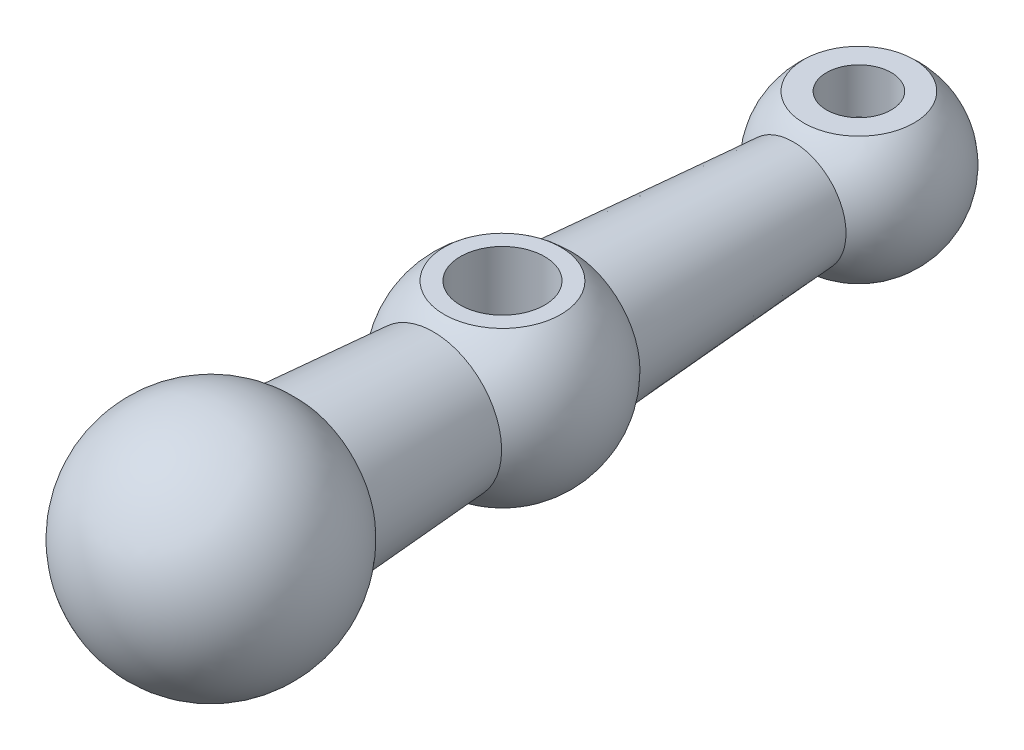
ISO-10303-21;
HEADER;
FILE_DESCRIPTION(('STEP AP214'),'2;1');
FILE_NAME('part.step','',(''),(''),'','','');
FILE_SCHEMA(('AUTOMOTIVE_DESIGN { 1 0 10303 214 1 1 1 1 }'));
ENDSEC;
DATA;
#1=APPLICATION_CONTEXT('core data for automotive mechanical design processes');
#2=APPLICATION_PROTOCOL_DEFINITION('international standard','automotive_design',2000,#1);
#3=PRODUCT_CONTEXT('',#1,'mechanical');
#4=PRODUCT('Part','Part','',(#3));
#5=PRODUCT_RELATED_PRODUCT_CATEGORY('part','',(#4));
#6=PRODUCT_DEFINITION_FORMATION('','',#4);
#7=PRODUCT_DEFINITION_CONTEXT('part definition',#1,'design');
#8=PRODUCT_DEFINITION('design','',#6,#7);
#9=PRODUCT_DEFINITION_SHAPE('','',#8);
#10=(LENGTH_UNIT() NAMED_UNIT(*) SI_UNIT(.MILLI.,.METRE.));
#11=(NAMED_UNIT(*) PLANE_ANGLE_UNIT() SI_UNIT($,.RADIAN.));
#12=(NAMED_UNIT(*) SI_UNIT($,.STERADIAN.) SOLID_ANGLE_UNIT());
#13=UNCERTAINTY_MEASURE_WITH_UNIT(LENGTH_MEASURE(1.E-05),#10,'distance_accuracy_value','');
#14=(GEOMETRIC_REPRESENTATION_CONTEXT(3) GLOBAL_UNCERTAINTY_ASSIGNED_CONTEXT((#13)) GLOBAL_UNIT_ASSIGNED_CONTEXT((#10,
#11,#12)) REPRESENTATION_CONTEXT('',''));
#15=CARTESIAN_POINT('',(0.,0.,0.));
#16=DIRECTION('',(0.,0.,1.));
#17=DIRECTION('',(1.,0.,0.));
#18=AXIS2_PLACEMENT_3D('',#15,#16,#17);
#19=CARTESIAN_POINT('',(0.,0.,-55.));
#20=DIRECTION('',(0.,0.,1.));
#21=DIRECTION('',(0.,1.,0.));
#22=AXIS2_PLACEMENT_3D('',#19,#20,#21);
#23=SPHERICAL_SURFACE('',#22,13.);
#24=CARTESIAN_POINT('',(0.,0.,-44.8693734629778));
#25=DIRECTION('',(0.,0.,1.));
#26=DIRECTION('',(1.,0.,0.));
#27=AXIS2_PLACEMENT_3D('',#24,#25,#26);
#28=CIRCLE('',#27,8.14680342019988);
#29=CARTESIAN_POINT('',(8.14680342019988,0.,-44.8693734629778));
#30=VERTEX_POINT('',#29);
#31=EDGE_CURVE('E49',#30,#30,#28,.T.);
#32=ORIENTED_EDGE('',*,*,#31,.F.);
#33=EDGE_LOOP('',(#32));
#34=FACE_BOUND('',#33,.T.);
#35=CARTESIAN_POINT('',(0.,9.836157786453,-55.));
#36=DIRECTION('',(0.,1.,0.));
#37=DIRECTION('',(0.,0.,1.));
#38=AXIS2_PLACEMENT_3D('',#35,#36,#37);
#39=CIRCLE('',#38,8.5);
#40=CARTESIAN_POINT('',(0.,9.836157786453,-46.5));
#41=VERTEX_POINT('',#40);
#42=EDGE_CURVE('E12',#41,#41,#39,.T.);
#43=ORIENTED_EDGE('',*,*,#42,.F.);
#44=EDGE_LOOP('',(#43));
#45=FACE_BOUND('',#44,.T.);
#46=ADVANCED_FACE('F41',(#34,#45),#23,.T.);
#47=CARTESIAN_POINT('',(0.,0.,0.));
#48=DIRECTION('',(0.,0.,1.));
#49=DIRECTION('',(0.,1.,0.));
#50=AXIS2_PLACEMENT_3D('',#47,#48,#49);
#51=SPHERICAL_SURFACE('',#50,15.);
#52=CARTESIAN_POINT('',(0.,0.,-10.6748436443769));
#53=DIRECTION('',(0.,0.,1.));
#54=DIRECTION('',(1.,0.,0.));
#55=AXIS2_PLACEMENT_3D('',#52,#53,#54);
#56=CIRCLE('',#55,10.537917876322);
#57=CARTESIAN_POINT('',(10.537917876322,0.,-10.6748436443769));
#58=VERTEX_POINT('',#57);
#59=EDGE_CURVE('E91',#58,#58,#56,.T.);
#60=ORIENTED_EDGE('',*,*,#59,.T.);
#61=EDGE_LOOP('',(#60));
#62=FACE_BOUND('',#61,.T.);
#63=CARTESIAN_POINT('',(0.,0.,10.6748436443769));
#64=DIRECTION('',(0.,0.,1.));
#65=DIRECTION('',(1.,0.,0.));
#66=AXIS2_PLACEMENT_3D('',#63,#64,#65);
#67=CIRCLE('',#66,10.537917876322);
#68=CARTESIAN_POINT('',(10.537917876322,0.,10.6748436443769));
#69=VERTEX_POINT('',#68);
#70=EDGE_CURVE('E87',#69,#69,#67,.T.);
#71=ORIENTED_EDGE('',*,*,#70,.F.);
#72=EDGE_LOOP('',(#71));
#73=FACE_BOUND('',#72,.T.);
#74=CARTESIAN_POINT('',(0.,-12.,0.));
#75=DIRECTION('',(0.,1.,0.));
#76=DIRECTION('',(0.,0.,1.));
#77=AXIS2_PLACEMENT_3D('',#74,#75,#76);
#78=CIRCLE('',#77,9.00000000000001);
#79=CARTESIAN_POINT('',(0.,-12.,9.00000000000001));
#80=VERTEX_POINT('',#79);
#81=EDGE_CURVE('E79',#80,#80,#78,.T.);
#82=ORIENTED_EDGE('',*,*,#81,.T.);
#83=EDGE_LOOP('',(#82));
#84=FACE_BOUND('',#83,.T.);
#85=CARTESIAN_POINT('',(0.,12.,0.));
#86=DIRECTION('',(0.,1.,0.));
#87=DIRECTION('',(0.,0.,1.));
#88=AXIS2_PLACEMENT_3D('',#85,#86,#87);
#89=CIRCLE('',#88,9.);
#90=CARTESIAN_POINT('',(0.,12.,9.));
#91=VERTEX_POINT('',#90);
#92=EDGE_CURVE('E70',#91,#91,#89,.T.);
#93=ORIENTED_EDGE('',*,*,#92,.F.);
#94=EDGE_LOOP('',(#93));
#95=FACE_BOUND('',#94,.T.);
#96=ADVANCED_FACE('F112',(#62,#73,#84,#95),#51,.T.);
#97=CARTESIAN_POINT('',(0.,0.,45.));
#98=DIRECTION('',(0.,0.,1.));
#99=DIRECTION('',(0.,1.,0.));
#100=AXIS2_PLACEMENT_3D('',#97,#98,#99);
#101=SPHERICAL_SURFACE('',#100,18.);
#102=CARTESIAN_POINT('',(0.,0.,31.5835921350013));
#103=DIRECTION('',(0.,0.,1.));
#104=DIRECTION('',(1.,0.,0.));
#105=AXIS2_PLACEMENT_3D('',#102,#103,#104);
#106=CIRCLE('',#105,12.);
#107=CARTESIAN_POINT('',(12.,0.,31.5835921350013));
#108=VERTEX_POINT('',#107);
#109=EDGE_CURVE('E83',#108,#108,#106,.T.);
#110=ORIENTED_EDGE('',*,*,#109,.T.);
#111=EDGE_LOOP('',(#110));
#112=FACE_BOUND('',#111,.T.);
#113=ADVANCED_FACE('F43',(#112),#101,.T.);
#114=CARTESIAN_POINT('',(0.,0.,-44.8693734629778));
#115=DIRECTION('',(0.,0.,1.));
#116=DIRECTION('',(1.,0.,0.));
#117=AXIS2_PLACEMENT_3D('',#114,#115,#116);
#118=CONICAL_SURFACE('',#117,8.14680342019988,0.0698131700797734);
#119=ORIENTED_EDGE('',*,*,#59,.F.);
#120=EDGE_LOOP('',(#119));
#121=FACE_BOUND('',#120,.T.);
#122=ORIENTED_EDGE('',*,*,#31,.T.);
#123=EDGE_LOOP('',(#122));
#124=FACE_BOUND('',#123,.T.);
#125=ADVANCED_FACE('F126',(#121,#124),#118,.T.);
#126=CARTESIAN_POINT('',(0.,0.,10.6748436443769));
#127=DIRECTION('',(0.,0.,1.));
#128=DIRECTION('',(1.,0.,0.));
#129=AXIS2_PLACEMENT_3D('',#126,#127,#128);
#130=CONICAL_SURFACE('',#129,10.537917876322,0.0698131700797733);
#131=ORIENTED_EDGE('',*,*,#109,.F.);
#132=EDGE_LOOP('',(#131));
#133=FACE_BOUND('',#132,.T.);
#134=ORIENTED_EDGE('',*,*,#70,.T.);
#135=EDGE_LOOP('',(#134));
#136=FACE_BOUND('',#135,.T.);
#137=ADVANCED_FACE('F120',(#133,#136),#130,.T.);
#138=CARTESIAN_POINT('',(18.,12.,0.));
#139=DIRECTION('',(0.,1.,0.));
#140=DIRECTION('',(0.,0.,1.));
#141=AXIS2_PLACEMENT_3D('',#138,#139,#140);
#142=PLANE('',#141);
#143=CARTESIAN_POINT('',(0.,12.,0.));
#144=DIRECTION('',(0.,1.,0.));
#145=DIRECTION('',(0.,0.,1.));
#146=AXIS2_PLACEMENT_3D('',#143,#144,#145);
#147=CIRCLE('',#146,6.5);
#148=CARTESIAN_POINT('',(0.,12.,6.5));
#149=VERTEX_POINT('',#148);
#150=EDGE_CURVE('E63',#149,#149,#147,.F.);
#151=ORIENTED_EDGE('',*,*,#150,.T.);
#152=EDGE_LOOP('',(#151));
#153=FACE_BOUND('',#152,.T.);
#154=ORIENTED_EDGE('',*,*,#92,.T.);
#155=EDGE_LOOP('',(#154));
#156=FACE_BOUND('',#155,.T.);
#157=ADVANCED_FACE('F108',(#153,#156),#142,.T.);
#158=CARTESIAN_POINT('',(18.,-12.,0.));
#159=DIRECTION('',(0.,1.,0.));
#160=DIRECTION('',(0.,0.,1.));
#161=AXIS2_PLACEMENT_3D('',#158,#159,#160);
#162=PLANE('',#161);
#163=CARTESIAN_POINT('',(0.,-12.,0.));
#164=DIRECTION('',(0.,1.,0.));
#165=DIRECTION('',(0.,0.,1.));
#166=AXIS2_PLACEMENT_3D('',#163,#164,#165);
#167=CIRCLE('',#166,6.5);
#168=CARTESIAN_POINT('',(0.,-12.,6.5));
#169=VERTEX_POINT('',#168);
#170=EDGE_CURVE('E78',#169,#169,#167,.F.);
#171=ORIENTED_EDGE('',*,*,#170,.F.);
#172=EDGE_LOOP('',(#171));
#173=FACE_BOUND('',#172,.T.);
#174=ORIENTED_EDGE('',*,*,#81,.F.);
#175=EDGE_LOOP('',(#174));
#176=FACE_BOUND('',#175,.T.);
#177=ADVANCED_FACE('F104',(#173,#176),#162,.F.);
#178=CARTESIAN_POINT('',(18.,9.836157786453,0.));
#179=DIRECTION('',(0.,1.,0.));
#180=DIRECTION('',(0.,0.,1.));
#181=AXIS2_PLACEMENT_3D('',#178,#179,#180);
#182=PLANE('',#181);
#183=CARTESIAN_POINT('',(0.,9.836157786453,-55.));
#184=DIRECTION('',(0.,1.,0.));
#185=DIRECTION('',(0.,0.,1.));
#186=AXIS2_PLACEMENT_3D('',#183,#184,#185);
#187=CIRCLE('',#186,4.99999999999999);
#188=CARTESIAN_POINT('',(0.,9.836157786453,-50.));
#189=VERTEX_POINT('',#188);
#190=EDGE_CURVE('E64',#189,#189,#187,.T.);
#191=ORIENTED_EDGE('',*,*,#190,.F.);
#192=EDGE_LOOP('',(#191));
#193=FACE_BOUND('',#192,.T.);
#194=ORIENTED_EDGE('',*,*,#42,.T.);
#195=EDGE_LOOP('',(#194));
#196=FACE_BOUND('',#195,.T.);
#197=ADVANCED_FACE('F107',(#193,#196),#182,.T.);
#198=CARTESIAN_POINT('',(0.,-18.,0.));
#199=DIRECTION('',(0.,1.,0.));
#200=DIRECTION('',(0.,0.,1.));
#201=AXIS2_PLACEMENT_3D('',#198,#199,#200);
#202=CYLINDRICAL_SURFACE('',#201,6.5);
#203=ORIENTED_EDGE('',*,*,#170,.T.);
#204=EDGE_LOOP('',(#203));
#205=FACE_BOUND('',#204,.T.);
#206=ORIENTED_EDGE('',*,*,#150,.F.);
#207=EDGE_LOOP('',(#206));
#208=FACE_BOUND('',#207,.T.);
#209=ADVANCED_FACE('F56',(#205,#208),#202,.F.);
#210=CARTESIAN_POINT('',(0.,2.8404608815908,-55.));
#211=DIRECTION('',(0.,1.,0.));
#212=DIRECTION('',(0.,0.,1.));
#213=AXIS2_PLACEMENT_3D('',#210,#211,#212);
#214=CONICAL_SURFACE('',#213,5.,1.02974425867665);
#215=CARTESIAN_POINT('',(0.,-0.163842213547002,-55.));
#216=VERTEX_POINT('',#215);
#217=VERTEX_LOOP('',#216);
#218=FACE_BOUND('',#217,.T.);
#219=CARTESIAN_POINT('',(0.,2.8404608815908,-55.));
#220=DIRECTION('',(0.,1.,0.));
#221=DIRECTION('',(0.,0.,1.));
#222=AXIS2_PLACEMENT_3D('',#219,#220,#221);
#223=CIRCLE('',#222,5.);
#224=CARTESIAN_POINT('',(0.,2.8404608815908,-50.));
#225=VERTEX_POINT('',#224);
#226=EDGE_CURVE('E60',#225,#225,#223,.T.);
#227=ORIENTED_EDGE('',*,*,#226,.T.);
#228=EDGE_LOOP('',(#227));
#229=FACE_BOUND('',#228,.T.);
#230=ADVANCED_FACE('F52',(#218,#229),#214,.F.);
#231=CARTESIAN_POINT('',(0.,9.836157786453,-55.));
#232=DIRECTION('',(0.,1.,0.));
#233=DIRECTION('',(0.,0.,1.));
#234=AXIS2_PLACEMENT_3D('',#231,#232,#233);
#235=CYLINDRICAL_SURFACE('',#234,4.99999999999999);
#236=ORIENTED_EDGE('',*,*,#226,.F.);
#237=EDGE_LOOP('',(#236));
#238=FACE_BOUND('',#237,.T.);
#239=ORIENTED_EDGE('',*,*,#190,.T.);
#240=EDGE_LOOP('',(#239));
#241=FACE_BOUND('',#240,.T.);
#242=ADVANCED_FACE('F55',(#238,#241),#235,.F.);
#243=CLOSED_SHELL('',(#46,#96,#113,#125,#137,#157,#177,#197,#209,#230,#242));
#244=MANIFOLD_SOLID_BREP('B2',#243);
#245=ADVANCED_BREP_SHAPE_REPRESENTATION('',(#18,#244),#14);
#246=SHAPE_DEFINITION_REPRESENTATION(#9,#245);
ENDSEC;
END-ISO-10303-21;
